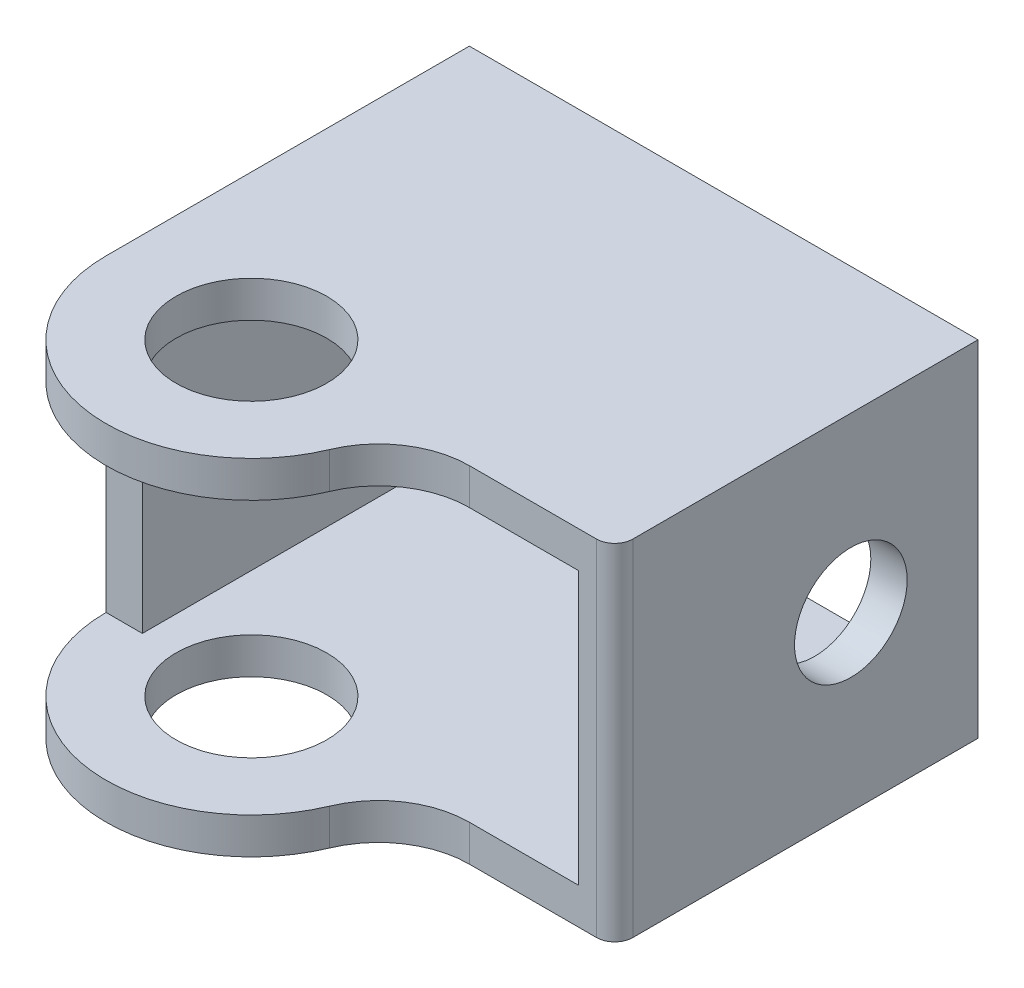
ISO-10303-21;
HEADER;
FILE_DESCRIPTION(('STEP AP214'),'2;1');
FILE_NAME('part.step','',(''),(''),'','','');
FILE_SCHEMA(('AUTOMOTIVE_DESIGN { 1 0 10303 214 1 1 1 1 }'));
ENDSEC;
DATA;
#1=APPLICATION_CONTEXT('core data for automotive mechanical design processes');
#2=APPLICATION_PROTOCOL_DEFINITION('international standard','automotive_design',2000,#1);
#3=PRODUCT_CONTEXT('',#1,'mechanical');
#4=PRODUCT('Part','Part','',(#3));
#5=PRODUCT_RELATED_PRODUCT_CATEGORY('part','',(#4));
#6=PRODUCT_DEFINITION_FORMATION('','',#4);
#7=PRODUCT_DEFINITION_CONTEXT('part definition',#1,'design');
#8=PRODUCT_DEFINITION('design','',#6,#7);
#9=PRODUCT_DEFINITION_SHAPE('','',#8);
#10=(LENGTH_UNIT() NAMED_UNIT(*) SI_UNIT(.MILLI.,.METRE.));
#11=(NAMED_UNIT(*) PLANE_ANGLE_UNIT() SI_UNIT($,.RADIAN.));
#12=(NAMED_UNIT(*) SI_UNIT($,.STERADIAN.) SOLID_ANGLE_UNIT());
#13=UNCERTAINTY_MEASURE_WITH_UNIT(LENGTH_MEASURE(1.E-05),#10,'distance_accuracy_value','');
#14=(GEOMETRIC_REPRESENTATION_CONTEXT(3) GLOBAL_UNCERTAINTY_ASSIGNED_CONTEXT((#13)) GLOBAL_UNIT_ASSIGNED_CONTEXT((#10,
#11,#12)) REPRESENTATION_CONTEXT('',''));
#15=CARTESIAN_POINT('',(0.,0.,0.));
#16=DIRECTION('',(0.,0.,1.));
#17=DIRECTION('',(1.,0.,0.));
#18=AXIS2_PLACEMENT_3D('',#15,#16,#17);
#19=CARTESIAN_POINT('',(-3.61630695443645,19.,11.3717026378897));
#20=DIRECTION('',(0.,-1.,0.));
#21=DIRECTION('',(0.,0.,-1.));
#22=AXIS2_PLACEMENT_3D('',#19,#20,#21);
#23=CYLINDRICAL_SURFACE('',#22,8.);
#24=CARTESIAN_POINT('',(-3.61630695443645,2.,11.3717026378897));
#25=DIRECTION('',(0.,-1.,0.));
#26=DIRECTION('',(0.,0.,-1.));
#27=AXIS2_PLACEMENT_3D('',#24,#25,#26);
#28=CIRCLE('',#27,8.);
#29=CARTESIAN_POINT('',(3.76830843017894,2.,14.4486257148128));
#30=VERTEX_POINT('',#29);
#31=CARTESIAN_POINT('',(-11.6163069544364,2.,11.3717026378897));
#32=VERTEX_POINT('',#31);
#33=EDGE_CURVE('E183',#30,#32,#28,.T.);
#34=ORIENTED_EDGE('',*,*,#33,.T.);
#35=DIRECTION('',(0.,-1.,0.));
#36=VECTOR('',#35,1.);
#37=CARTESIAN_POINT('',(-11.6163069544364,19.,11.3717026378897));
#38=LINE('',#37,#36);
#39=CARTESIAN_POINT('',(-11.6163069544364,0.,11.3717026378897));
#40=VERTEX_POINT('',#39);
#41=EDGE_CURVE('E161',#32,#40,#38,.T.);
#42=ORIENTED_EDGE('',*,*,#41,.T.);
#43=CARTESIAN_POINT('',(-3.61630695443645,0.,11.3717026378897));
#44=DIRECTION('',(0.,1.,0.));
#45=DIRECTION('',(0.,0.,1.));
#46=AXIS2_PLACEMENT_3D('',#43,#44,#45);
#47=CIRCLE('',#46,8.);
#48=CARTESIAN_POINT('',(3.76830843017894,0.,14.4486257148128));
#49=VERTEX_POINT('',#48);
#50=EDGE_CURVE('E226',#40,#49,#47,.T.);
#51=ORIENTED_EDGE('',*,*,#50,.T.);
#52=DIRECTION('',(0.,-1.,0.));
#53=VECTOR('',#52,1.);
#54=CARTESIAN_POINT('',(3.76830843017894,19.,14.4486257148128));
#55=LINE('',#54,#53);
#56=EDGE_CURVE('E242',#30,#49,#55,.T.);
#57=ORIENTED_EDGE('',*,*,#56,.F.);
#58=EDGE_LOOP('',(#34,#42,#51,#57));
#59=FACE_BOUND('',#58,.T.);
#60=ADVANCED_FACE('F32',(#59),#23,.T.);
#61=CARTESIAN_POINT('',(8.38369304556355,19.,16.3717026378897));
#62=DIRECTION('',(0.,-1.,0.));
#63=DIRECTION('',(0.,0.,-1.));
#64=AXIS2_PLACEMENT_3D('',#61,#62,#63);
#65=CYLINDRICAL_SURFACE('',#64,5.);
#66=CARTESIAN_POINT('',(3.76830843017894,19.,14.4486257148128));
#67=VERTEX_POINT('',#66);
#68=CARTESIAN_POINT('',(3.76830843017894,17.,14.4486257148128));
#69=VERTEX_POINT('',#68);
#70=EDGE_CURVE('E169',#67,#69,#55,.T.);
#71=ORIENTED_EDGE('',*,*,#70,.T.);
#72=CARTESIAN_POINT('',(8.38369304556355,17.,16.3717026378897));
#73=DIRECTION('',(0.,1.,0.));
#74=DIRECTION('',(0.,0.,1.));
#75=AXIS2_PLACEMENT_3D('',#72,#73,#74);
#76=CIRCLE('',#75,5.);
#77=CARTESIAN_POINT('',(8.38369304556355,17.,11.3717026378897));
#78=VERTEX_POINT('',#77);
#79=EDGE_CURVE('E136',#69,#78,#76,.F.);
#80=ORIENTED_EDGE('',*,*,#79,.T.);
#81=DIRECTION('',(0.,-1.,0.));
#82=VECTOR('',#81,1.);
#83=CARTESIAN_POINT('',(8.38369304556355,19.,11.3717026378897));
#84=LINE('',#83,#82);
#85=CARTESIAN_POINT('',(8.38369304556355,19.,11.3717026378897));
#86=VERTEX_POINT('',#85);
#87=EDGE_CURVE('E240',#86,#78,#84,.T.);
#88=ORIENTED_EDGE('',*,*,#87,.F.);
#89=CARTESIAN_POINT('',(8.38369304556355,19.,16.3717026378897));
#90=DIRECTION('',(0.,-1.,0.));
#91=DIRECTION('',(0.,0.,-1.));
#92=AXIS2_PLACEMENT_3D('',#89,#90,#91);
#93=CIRCLE('',#92,5.);
#94=EDGE_CURVE('E213',#67,#86,#93,.T.);
#95=ORIENTED_EDGE('',*,*,#94,.F.);
#96=EDGE_LOOP('',(#71,#80,#88,#95));
#97=FACE_BOUND('',#96,.T.);
#98=ADVANCED_FACE('F273',(#97),#65,.F.);
#99=CARTESIAN_POINT('',(-3.61630695443645,19.,11.3717026378897));
#100=DIRECTION('',(0.,-1.,0.));
#101=DIRECTION('',(0.,0.,-1.));
#102=AXIS2_PLACEMENT_3D('',#99,#100,#101);
#103=CYLINDRICAL_SURFACE('',#102,4.15);
#104=CARTESIAN_POINT('',(-3.61630695443645,17.,11.3717026378897));
#105=DIRECTION('',(0.,1.,0.));
#106=DIRECTION('',(0.,0.,1.));
#107=AXIS2_PLACEMENT_3D('',#104,#105,#106);
#108=CIRCLE('',#107,4.15);
#109=CARTESIAN_POINT('',(-3.61630695443645,17.,15.5217026378897));
#110=VERTEX_POINT('',#109);
#111=EDGE_CURVE('E180',#110,#110,#108,.T.);
#112=ORIENTED_EDGE('',*,*,#111,.F.);
#113=EDGE_LOOP('',(#112));
#114=FACE_BOUND('',#113,.T.);
#115=CARTESIAN_POINT('',(-3.61630695443645,19.,11.3717026378897));
#116=DIRECTION('',(0.,1.,0.));
#117=DIRECTION('',(0.,0.,-1.));
#118=AXIS2_PLACEMENT_3D('',#115,#116,#117);
#119=CIRCLE('',#118,4.15);
#120=CARTESIAN_POINT('',(-3.61630695443645,19.,7.22170263788969));
#121=VERTEX_POINT('',#120);
#122=EDGE_CURVE('E198',#121,#121,#119,.T.);
#123=ORIENTED_EDGE('',*,*,#122,.T.);
#124=EDGE_LOOP('',(#123));
#125=FACE_BOUND('',#124,.T.);
#126=ADVANCED_FACE('F275',(#114,#125),#103,.F.);
#127=CARTESIAN_POINT('',(15.3836930455636,19.,10.3717026378897));
#128=DIRECTION('',(0.,-1.,0.));
#129=DIRECTION('',(0.,0.,-1.));
#130=AXIS2_PLACEMENT_3D('',#127,#128,#129);
#131=PLANE('',#130);
#132=DIRECTION('',(0.,0.,-1.));
#133=VECTOR('',#132,1.);
#134=CARTESIAN_POINT('',(16.3836930455636,19.,-8.62829736211031));
#135=LINE('',#134,#133);
#136=CARTESIAN_POINT('',(16.3836930455636,19.,10.3717026378897));
#137=VERTEX_POINT('',#136);
#138=CARTESIAN_POINT('',(16.3836930455636,19.,-8.62829736211031));
#139=VERTEX_POINT('',#138);
#140=EDGE_CURVE('E204',#137,#139,#135,.T.);
#141=ORIENTED_EDGE('',*,*,#140,.T.);
#142=DIRECTION('',(-1.,0.,0.));
#143=VECTOR('',#142,1.);
#144=CARTESIAN_POINT('',(16.3836930455636,19.,-8.62829736211031));
#145=LINE('',#144,#143);
#146=CARTESIAN_POINT('',(-11.6163069544365,19.,-8.62829736211031));
#147=VERTEX_POINT('',#146);
#148=EDGE_CURVE('E207',#139,#147,#145,.T.);
#149=ORIENTED_EDGE('',*,*,#148,.T.);
#150=DIRECTION('',(0.,0.,1.));
#151=VECTOR('',#150,1.);
#152=CARTESIAN_POINT('',(-11.6163069544365,19.,-8.62829736211031));
#153=LINE('',#152,#151);
#154=CARTESIAN_POINT('',(-11.6163069544364,19.,11.3717026378897));
#155=VERTEX_POINT('',#154);
#156=EDGE_CURVE('E210',#147,#155,#153,.T.);
#157=ORIENTED_EDGE('',*,*,#156,.T.);
#158=CARTESIAN_POINT('',(-3.61630695443645,19.,11.3717026378897));
#159=DIRECTION('',(0.,1.,0.));
#160=DIRECTION('',(0.,0.,1.));
#161=AXIS2_PLACEMENT_3D('',#158,#159,#160);
#162=CIRCLE('',#161,8.);
#163=EDGE_CURVE('E164',#155,#67,#162,.T.);
#164=ORIENTED_EDGE('',*,*,#163,.T.);
#165=ORIENTED_EDGE('',*,*,#94,.T.);
#166=DIRECTION('',(1.,0.,0.));
#167=VECTOR('',#166,1.);
#168=CARTESIAN_POINT('',(15.3836930455636,19.,11.3717026378897));
#169=LINE('',#168,#167);
#170=CARTESIAN_POINT('',(15.3836930455636,19.,11.3717026378897));
#171=VERTEX_POINT('',#170);
#172=EDGE_CURVE('E215',#86,#171,#169,.T.);
#173=ORIENTED_EDGE('',*,*,#172,.T.);
#174=CARTESIAN_POINT('',(15.3836930455636,19.,10.3717026378897));
#175=DIRECTION('',(0.,1.,0.));
#176=DIRECTION('',(0.,0.,-1.));
#177=AXIS2_PLACEMENT_3D('',#174,#175,#176);
#178=CIRCLE('',#177,1.);
#179=EDGE_CURVE('E217',#171,#137,#178,.T.);
#180=ORIENTED_EDGE('',*,*,#179,.T.);
#181=EDGE_LOOP('',(#141,#149,#157,#164,#165,#173,#180));
#182=FACE_BOUND('',#181,.T.);
#183=ORIENTED_EDGE('',*,*,#122,.F.);
#184=EDGE_LOOP('',(#183));
#185=FACE_BOUND('',#184,.T.);
#186=ADVANCED_FACE('F268',(#182,#185),#131,.F.);
#187=CARTESIAN_POINT('',(15.3836930455636,0.,10.3717026378897));
#188=DIRECTION('',(0.,-1.,0.));
#189=DIRECTION('',(0.,0.,-1.));
#190=AXIS2_PLACEMENT_3D('',#187,#188,#189);
#191=PLANE('',#190);
#192=DIRECTION('',(0.,0.,-1.));
#193=VECTOR('',#192,1.);
#194=CARTESIAN_POINT('',(16.3836930455636,0.,-8.62829736211031));
#195=LINE('',#194,#193);
#196=CARTESIAN_POINT('',(16.3836930455636,0.,10.3717026378897));
#197=VERTEX_POINT('',#196);
#198=CARTESIAN_POINT('',(16.3836930455636,0.,-8.62829736211031));
#199=VERTEX_POINT('',#198);
#200=EDGE_CURVE('E201',#197,#199,#195,.T.);
#201=ORIENTED_EDGE('',*,*,#200,.F.);
#202=CARTESIAN_POINT('',(15.3836930455636,0.,10.3717026378897));
#203=DIRECTION('',(0.,1.,0.));
#204=DIRECTION('',(0.,0.,-1.));
#205=AXIS2_PLACEMENT_3D('',#202,#203,#204);
#206=CIRCLE('',#205,1.);
#207=CARTESIAN_POINT('',(15.3836930455636,0.,11.3717026378897));
#208=VERTEX_POINT('',#207);
#209=EDGE_CURVE('E208',#208,#197,#206,.T.);
#210=ORIENTED_EDGE('',*,*,#209,.F.);
#211=DIRECTION('',(1.,0.,0.));
#212=VECTOR('',#211,1.);
#213=CARTESIAN_POINT('',(15.3836930455636,0.,11.3717026378897));
#214=LINE('',#213,#212);
#215=CARTESIAN_POINT('',(8.38369304556355,0.,11.3717026378897));
#216=VERTEX_POINT('',#215);
#217=EDGE_CURVE('E232',#216,#208,#214,.T.);
#218=ORIENTED_EDGE('',*,*,#217,.F.);
#219=CARTESIAN_POINT('',(8.38369304556355,0.,16.3717026378897));
#220=DIRECTION('',(0.,-1.,0.));
#221=DIRECTION('',(0.,0.,-1.));
#222=AXIS2_PLACEMENT_3D('',#219,#220,#221);
#223=CIRCLE('',#222,5.);
#224=EDGE_CURVE('E229',#49,#216,#223,.T.);
#225=ORIENTED_EDGE('',*,*,#224,.F.);
#226=ORIENTED_EDGE('',*,*,#50,.F.);
#227=DIRECTION('',(0.,0.,1.));
#228=VECTOR('',#227,1.);
#229=CARTESIAN_POINT('',(-11.6163069544365,0.,-8.62829736211031));
#230=LINE('',#229,#228);
#231=CARTESIAN_POINT('',(-11.6163069544365,0.,-8.62829736211031));
#232=VERTEX_POINT('',#231);
#233=EDGE_CURVE('E224',#232,#40,#230,.T.);
#234=ORIENTED_EDGE('',*,*,#233,.F.);
#235=DIRECTION('',(-1.,0.,0.));
#236=VECTOR('',#235,1.);
#237=CARTESIAN_POINT('',(16.3836930455636,0.,-8.62829736211031));
#238=LINE('',#237,#236);
#239=EDGE_CURVE('E222',#199,#232,#238,.T.);
#240=ORIENTED_EDGE('',*,*,#239,.F.);
#241=EDGE_LOOP('',(#201,#210,#218,#225,#226,#234,#240));
#242=FACE_BOUND('',#241,.T.);
#243=CARTESIAN_POINT('',(-3.61630695443645,0.,11.3717026378897));
#244=DIRECTION('',(0.,1.,0.));
#245=DIRECTION('',(0.,0.,1.));
#246=AXIS2_PLACEMENT_3D('',#243,#244,#245);
#247=CIRCLE('',#246,4.15);
#248=CARTESIAN_POINT('',(-3.61630695443645,0.,15.5217026378897));
#249=VERTEX_POINT('',#248);
#250=EDGE_CURVE('E141',#249,#249,#247,.T.);
#251=ORIENTED_EDGE('',*,*,#250,.T.);
#252=EDGE_LOOP('',(#251));
#253=FACE_BOUND('',#252,.T.);
#254=ADVANCED_FACE('F258',(#242,#253),#191,.T.);
#255=CARTESIAN_POINT('',(16.3836930455636,19.,-8.62829736211031));
#256=DIRECTION('',(-1.,0.,0.));
#257=DIRECTION('',(0.,0.,1.));
#258=AXIS2_PLACEMENT_3D('',#255,#256,#257);
#259=PLANE('',#258);
#260=CARTESIAN_POINT('',(16.3836930455636,9.5,-1.62829736211031));
#261=DIRECTION('',(1.,0.,0.));
#262=DIRECTION('',(0.,0.,-1.));
#263=AXIS2_PLACEMENT_3D('',#260,#261,#262);
#264=CIRCLE('',#263,3.1);
#265=CARTESIAN_POINT('',(16.3836930455636,9.5,-4.72829736211031));
#266=VERTEX_POINT('',#265);
#267=EDGE_CURVE('E334',#266,#266,#264,.T.);
#268=ORIENTED_EDGE('',*,*,#267,.F.);
#269=EDGE_LOOP('',(#268));
#270=FACE_BOUND('',#269,.T.);
#271=ORIENTED_EDGE('',*,*,#200,.T.);
#272=DIRECTION('',(0.,-1.,0.));
#273=VECTOR('',#272,1.);
#274=CARTESIAN_POINT('',(16.3836930455636,19.,-8.62829736211031));
#275=LINE('',#274,#273);
#276=EDGE_CURVE('E41',#139,#199,#275,.T.);
#277=ORIENTED_EDGE('',*,*,#276,.F.);
#278=ORIENTED_EDGE('',*,*,#140,.F.);
#279=DIRECTION('',(0.,-1.,0.));
#280=VECTOR('',#279,1.);
#281=CARTESIAN_POINT('',(16.3836930455636,19.,10.3717026378897));
#282=LINE('',#281,#280);
#283=EDGE_CURVE('E219',#137,#197,#282,.T.);
#284=ORIENTED_EDGE('',*,*,#283,.T.);
#285=EDGE_LOOP('',(#271,#277,#278,#284));
#286=FACE_BOUND('',#285,.T.);
#287=ADVANCED_FACE('F34',(#270,#286),#259,.F.);
#288=CARTESIAN_POINT('',(16.3836930455636,19.,-8.62829736211031));
#289=DIRECTION('',(0.,0.,1.));
#290=DIRECTION('',(1.,0.,0.));
#291=AXIS2_PLACEMENT_3D('',#288,#289,#290);
#292=PLANE('',#291);
#293=DIRECTION('',(-1.,0.,0.));
#294=VECTOR('',#293,1.);
#295=CARTESIAN_POINT('',(14.3836930455636,2.,-8.62829736211031));
#296=LINE('',#295,#294);
#297=CARTESIAN_POINT('',(14.3836930455636,2.,-8.62829736211031));
#298=VERTEX_POINT('',#297);
#299=CARTESIAN_POINT('',(-9.61630695443645,2.,-8.62829736211031));
#300=VERTEX_POINT('',#299);
#301=EDGE_CURVE('E306',#298,#300,#296,.T.);
#302=ORIENTED_EDGE('',*,*,#301,.F.);
#303=DIRECTION('',(0.,-1.,0.));
#304=VECTOR('',#303,1.);
#305=CARTESIAN_POINT('',(14.3836930455636,17.,-8.62829736211031));
#306=LINE('',#305,#304);
#307=CARTESIAN_POINT('',(14.3836930455636,17.,-8.62829736211031));
#308=VERTEX_POINT('',#307);
#309=EDGE_CURVE('E56',#308,#298,#306,.T.);
#310=ORIENTED_EDGE('',*,*,#309,.F.);
#311=DIRECTION('',(1.,0.,0.));
#312=VECTOR('',#311,1.);
#313=CARTESIAN_POINT('',(-9.61630695443645,17.,-8.62829736211031));
#314=LINE('',#313,#312);
#315=CARTESIAN_POINT('',(-9.61630695443645,17.,-8.62829736211031));
#316=VERTEX_POINT('',#315);
#317=EDGE_CURVE('E314',#316,#308,#314,.T.);
#318=ORIENTED_EDGE('',*,*,#317,.F.);
#319=DIRECTION('',(0.,1.,0.));
#320=VECTOR('',#319,1.);
#321=CARTESIAN_POINT('',(-9.61630695443645,2.,-8.62829736211031));
#322=LINE('',#321,#320);
#323=EDGE_CURVE('E310',#300,#316,#322,.T.);
#324=ORIENTED_EDGE('',*,*,#323,.F.);
#325=EDGE_LOOP('',(#302,#310,#318,#324));
#326=FACE_BOUND('',#325,.T.);
#327=ORIENTED_EDGE('',*,*,#239,.T.);
#328=DIRECTION('',(0.,-1.,0.));
#329=VECTOR('',#328,1.);
#330=CARTESIAN_POINT('',(-11.6163069544365,19.,-8.62829736211031));
#331=LINE('',#330,#329);
#332=EDGE_CURVE('E165',#147,#232,#331,.T.);
#333=ORIENTED_EDGE('',*,*,#332,.F.);
#334=ORIENTED_EDGE('',*,*,#148,.F.);
#335=ORIENTED_EDGE('',*,*,#276,.T.);
#336=EDGE_LOOP('',(#327,#333,#334,#335));
#337=FACE_BOUND('',#336,.T.);
#338=ADVANCED_FACE('F294',(#326,#337),#292,.F.);
#339=CARTESIAN_POINT('',(-11.6163069544365,19.,-8.62829736211031));
#340=DIRECTION('',(1.,0.,0.));
#341=DIRECTION('',(0.,0.,-1.));
#342=AXIS2_PLACEMENT_3D('',#339,#340,#341);
#343=PLANE('',#342);
#344=ORIENTED_EDGE('',*,*,#233,.T.);
#345=ORIENTED_EDGE('',*,*,#41,.F.);
#346=DIRECTION('',(0.,-1.,0.));
#347=VECTOR('',#346,1.);
#348=CARTESIAN_POINT('',(-11.6163069544364,17.,11.3717026378897));
#349=LINE('',#348,#347);
#350=CARTESIAN_POINT('',(-11.6163069544364,17.,11.3717026378897));
#351=VERTEX_POINT('',#350);
#352=EDGE_CURVE('E147',#351,#32,#349,.T.);
#353=ORIENTED_EDGE('',*,*,#352,.F.);
#354=EDGE_CURVE('E159',#155,#351,#38,.T.);
#355=ORIENTED_EDGE('',*,*,#354,.F.);
#356=ORIENTED_EDGE('',*,*,#156,.F.);
#357=ORIENTED_EDGE('',*,*,#332,.T.);
#358=EDGE_LOOP('',(#344,#345,#353,#355,#356,#357));
#359=FACE_BOUND('',#358,.T.);
#360=ADVANCED_FACE('F157',(#359),#343,.F.);
#361=ORIENTED_EDGE('',*,*,#354,.T.);
#362=CARTESIAN_POINT('',(-3.61630695443645,17.,11.3717026378897));
#363=DIRECTION('',(0.,1.,0.));
#364=DIRECTION('',(0.,0.,1.));
#365=AXIS2_PLACEMENT_3D('',#362,#363,#364);
#366=CIRCLE('',#365,8.);
#367=EDGE_CURVE('E133',#351,#69,#366,.T.);
#368=ORIENTED_EDGE('',*,*,#367,.T.);
#369=ORIENTED_EDGE('',*,*,#70,.F.);
#370=ORIENTED_EDGE('',*,*,#163,.F.);
#371=EDGE_LOOP('',(#361,#368,#369,#370));
#372=FACE_BOUND('',#371,.T.);
#373=ADVANCED_FACE('F163',(#372),#23,.T.);
#374=CARTESIAN_POINT('',(8.38369304556355,2.,11.3717026378897));
#375=VERTEX_POINT('',#374);
#376=EDGE_CURVE('E239',#375,#216,#84,.T.);
#377=ORIENTED_EDGE('',*,*,#376,.F.);
#378=CARTESIAN_POINT('',(8.38369304556355,2.,16.3717026378897));
#379=DIRECTION('',(0.,-1.,0.));
#380=DIRECTION('',(0.,0.,-1.));
#381=AXIS2_PLACEMENT_3D('',#378,#379,#380);
#382=CIRCLE('',#381,5.);
#383=EDGE_CURVE('E188',#375,#30,#382,.F.);
#384=ORIENTED_EDGE('',*,*,#383,.T.);
#385=ORIENTED_EDGE('',*,*,#56,.T.);
#386=ORIENTED_EDGE('',*,*,#224,.T.);
#387=EDGE_LOOP('',(#377,#384,#385,#386));
#388=FACE_BOUND('',#387,.T.);
#389=ADVANCED_FACE('F254',(#388),#65,.F.);
#390=CARTESIAN_POINT('',(15.3836930455636,19.,11.3717026378897));
#391=DIRECTION('',(0.,0.,-1.));
#392=DIRECTION('',(-1.,0.,0.));
#393=AXIS2_PLACEMENT_3D('',#390,#391,#392);
#394=PLANE('',#393);
#395=DIRECTION('',(1.,0.,0.));
#396=VECTOR('',#395,1.);
#397=CARTESIAN_POINT('',(15.3836930455636,17.,11.3717026378897));
#398=LINE('',#397,#396);
#399=CARTESIAN_POINT('',(14.3836930455636,17.,11.3717026378897));
#400=VERTEX_POINT('',#399);
#401=EDGE_CURVE('E182',#78,#400,#398,.T.);
#402=ORIENTED_EDGE('',*,*,#401,.T.);
#403=DIRECTION('',(0.,-1.,0.));
#404=VECTOR('',#403,1.);
#405=CARTESIAN_POINT('',(14.3836930455636,19.,11.3717026378897));
#406=LINE('',#405,#404);
#407=CARTESIAN_POINT('',(14.3836930455636,2.,11.3717026378897));
#408=VERTEX_POINT('',#407);
#409=EDGE_CURVE('E11',#400,#408,#406,.T.);
#410=ORIENTED_EDGE('',*,*,#409,.T.);
#411=DIRECTION('',(-1.,0.,0.));
#412=VECTOR('',#411,1.);
#413=CARTESIAN_POINT('',(15.3836930455636,2.,11.3717026378897));
#414=LINE('',#413,#412);
#415=EDGE_CURVE('E178',#408,#375,#414,.T.);
#416=ORIENTED_EDGE('',*,*,#415,.T.);
#417=ORIENTED_EDGE('',*,*,#376,.T.);
#418=ORIENTED_EDGE('',*,*,#217,.T.);
#419=DIRECTION('',(0.,-1.,0.));
#420=VECTOR('',#419,1.);
#421=CARTESIAN_POINT('',(15.3836930455636,19.,11.3717026378897));
#422=LINE('',#421,#420);
#423=EDGE_CURVE('E238',#171,#208,#422,.T.);
#424=ORIENTED_EDGE('',*,*,#423,.F.);
#425=ORIENTED_EDGE('',*,*,#172,.F.);
#426=ORIENTED_EDGE('',*,*,#87,.T.);
#427=EDGE_LOOP('',(#402,#410,#416,#417,#418,#424,#425,#426));
#428=FACE_BOUND('',#427,.T.);
#429=ADVANCED_FACE('F248',(#428),#394,.F.);
#430=CARTESIAN_POINT('',(15.3836930455636,19.,10.3717026378897));
#431=DIRECTION('',(0.,-1.,0.));
#432=DIRECTION('',(0.,0.,-1.));
#433=AXIS2_PLACEMENT_3D('',#430,#431,#432);
#434=CYLINDRICAL_SURFACE('',#433,1.);
#435=ORIENTED_EDGE('',*,*,#209,.T.);
#436=ORIENTED_EDGE('',*,*,#283,.F.);
#437=ORIENTED_EDGE('',*,*,#179,.F.);
#438=ORIENTED_EDGE('',*,*,#423,.T.);
#439=EDGE_LOOP('',(#435,#436,#437,#438));
#440=FACE_BOUND('',#439,.T.);
#441=ADVANCED_FACE('F262',(#440),#434,.T.);
#442=CARTESIAN_POINT('',(-3.61630695443645,2.,11.3717026378897));
#443=DIRECTION('',(0.,-1.,0.));
#444=DIRECTION('',(0.,0.,-1.));
#445=AXIS2_PLACEMENT_3D('',#442,#443,#444);
#446=CIRCLE('',#445,4.15);
#447=CARTESIAN_POINT('',(-3.61630695443645,2.,7.22170263788969));
#448=VERTEX_POINT('',#447);
#449=EDGE_CURVE('E175',#448,#448,#446,.T.);
#450=ORIENTED_EDGE('',*,*,#449,.F.);
#451=EDGE_LOOP('',(#450));
#452=FACE_BOUND('',#451,.T.);
#453=ORIENTED_EDGE('',*,*,#250,.F.);
#454=EDGE_LOOP('',(#453));
#455=FACE_BOUND('',#454,.T.);
#456=ADVANCED_FACE('F283',(#452,#455),#103,.F.);
#457=CARTESIAN_POINT('',(-9.61630695443645,2.,19.3717026378897));
#458=DIRECTION('',(-1.,0.,0.));
#459=DIRECTION('',(0.,0.,1.));
#460=AXIS2_PLACEMENT_3D('',#457,#458,#459);
#461=PLANE('',#460);
#462=DIRECTION('',(0.,0.,-1.));
#463=VECTOR('',#462,1.);
#464=CARTESIAN_POINT('',(-9.61630695443645,17.,19.3717026378897));
#465=LINE('',#464,#463);
#466=CARTESIAN_POINT('',(-9.61630695443645,17.,11.3717026378897));
#467=VERTEX_POINT('',#466);
#468=EDGE_CURVE('E323',#467,#316,#465,.T.);
#469=ORIENTED_EDGE('',*,*,#468,.F.);
#470=DIRECTION('',(0.,-1.,0.));
#471=VECTOR('',#470,1.);
#472=CARTESIAN_POINT('',(-9.61630695443645,2.,11.3717026378897));
#473=LINE('',#472,#471);
#474=CARTESIAN_POINT('',(-9.61630695443645,2.,11.3717026378897));
#475=VERTEX_POINT('',#474);
#476=EDGE_CURVE('E150',#467,#475,#473,.T.);
#477=ORIENTED_EDGE('',*,*,#476,.T.);
#478=DIRECTION('',(0.,0.,-1.));
#479=VECTOR('',#478,1.);
#480=CARTESIAN_POINT('',(-9.61630695443645,2.,19.3717026378897));
#481=LINE('',#480,#479);
#482=EDGE_CURVE('E325',#475,#300,#481,.T.);
#483=ORIENTED_EDGE('',*,*,#482,.T.);
#484=ORIENTED_EDGE('',*,*,#323,.T.);
#485=EDGE_LOOP('',(#469,#477,#483,#484));
#486=FACE_BOUND('',#485,.T.);
#487=ADVANCED_FACE('F331',(#486),#461,.F.);
#488=CARTESIAN_POINT('',(14.3836930455636,17.,19.3717026378897));
#489=DIRECTION('',(1.,0.,0.));
#490=DIRECTION('',(0.,0.,-1.));
#491=AXIS2_PLACEMENT_3D('',#488,#489,#490);
#492=PLANE('',#491);
#493=CARTESIAN_POINT('',(14.3836930455636,9.5,-1.62829736211031));
#494=DIRECTION('',(1.,0.,0.));
#495=DIRECTION('',(0.,0.,-1.));
#496=AXIS2_PLACEMENT_3D('',#493,#494,#495);
#497=CIRCLE('',#496,3.1);
#498=CARTESIAN_POINT('',(14.3836930455636,9.5,-4.72829736211031));
#499=VERTEX_POINT('',#498);
#500=EDGE_CURVE('E36',#499,#499,#497,.T.);
#501=ORIENTED_EDGE('',*,*,#500,.T.);
#502=EDGE_LOOP('',(#501));
#503=FACE_BOUND('',#502,.T.);
#504=DIRECTION('',(0.,0.,-1.));
#505=VECTOR('',#504,1.);
#506=CARTESIAN_POINT('',(14.3836930455636,17.,19.3717026378897));
#507=LINE('',#506,#505);
#508=EDGE_CURVE('E179',#400,#308,#507,.T.);
#509=ORIENTED_EDGE('',*,*,#508,.T.);
#510=ORIENTED_EDGE('',*,*,#309,.T.);
#511=DIRECTION('',(0.,0.,-1.));
#512=VECTOR('',#511,1.);
#513=CARTESIAN_POINT('',(14.3836930455636,2.,19.3717026378897));
#514=LINE('',#513,#512);
#515=EDGE_CURVE('E321',#408,#298,#514,.T.);
#516=ORIENTED_EDGE('',*,*,#515,.F.);
#517=ORIENTED_EDGE('',*,*,#409,.F.);
#518=EDGE_LOOP('',(#509,#510,#516,#517));
#519=FACE_BOUND('',#518,.T.);
#520=ADVANCED_FACE('F328',(#503,#519),#492,.F.);
#521=CARTESIAN_POINT('',(-9.61630695443645,17.,19.3717026378897));
#522=DIRECTION('',(0.,1.,0.));
#523=DIRECTION('',(0.,0.,1.));
#524=AXIS2_PLACEMENT_3D('',#521,#522,#523);
#525=PLANE('',#524);
#526=ORIENTED_EDGE('',*,*,#111,.T.);
#527=EDGE_LOOP('',(#526));
#528=FACE_BOUND('',#527,.T.);
#529=ORIENTED_EDGE('',*,*,#401,.F.);
#530=ORIENTED_EDGE('',*,*,#79,.F.);
#531=ORIENTED_EDGE('',*,*,#367,.F.);
#532=DIRECTION('',(-1.,0.,0.));
#533=VECTOR('',#532,1.);
#534=CARTESIAN_POINT('',(16.3836930455636,17.,11.3717026378897));
#535=LINE('',#534,#533);
#536=EDGE_CURVE('E48',#467,#351,#535,.T.);
#537=ORIENTED_EDGE('',*,*,#536,.F.);
#538=ORIENTED_EDGE('',*,*,#468,.T.);
#539=ORIENTED_EDGE('',*,*,#317,.T.);
#540=ORIENTED_EDGE('',*,*,#508,.F.);
#541=EDGE_LOOP('',(#529,#530,#531,#537,#538,#539,#540));
#542=FACE_BOUND('',#541,.T.);
#543=ADVANCED_FACE('F134',(#528,#542),#525,.F.);
#544=CARTESIAN_POINT('',(14.3836930455636,2.,19.3717026378897));
#545=DIRECTION('',(0.,-1.,0.));
#546=DIRECTION('',(0.,0.,-1.));
#547=AXIS2_PLACEMENT_3D('',#544,#545,#546);
#548=PLANE('',#547);
#549=ORIENTED_EDGE('',*,*,#449,.T.);
#550=EDGE_LOOP('',(#549));
#551=FACE_BOUND('',#550,.T.);
#552=ORIENTED_EDGE('',*,*,#482,.F.);
#553=DIRECTION('',(-1.,0.,0.));
#554=VECTOR('',#553,1.);
#555=CARTESIAN_POINT('',(16.3836930455636,2.,11.3717026378897));
#556=LINE('',#555,#554);
#557=EDGE_CURVE('E152',#475,#32,#556,.T.);
#558=ORIENTED_EDGE('',*,*,#557,.T.);
#559=ORIENTED_EDGE('',*,*,#33,.F.);
#560=ORIENTED_EDGE('',*,*,#383,.F.);
#561=ORIENTED_EDGE('',*,*,#415,.F.);
#562=ORIENTED_EDGE('',*,*,#515,.T.);
#563=ORIENTED_EDGE('',*,*,#301,.T.);
#564=EDGE_LOOP('',(#552,#558,#559,#560,#561,#562,#563));
#565=FACE_BOUND('',#564,.T.);
#566=ADVANCED_FACE('F327',(#551,#565),#548,.F.);
#567=CARTESIAN_POINT('',(16.3836930455636,17.,11.3717026378897));
#568=DIRECTION('',(0.,0.,-1.));
#569=DIRECTION('',(-1.,0.,0.));
#570=AXIS2_PLACEMENT_3D('',#567,#568,#569);
#571=PLANE('',#570);
#572=ORIENTED_EDGE('',*,*,#536,.T.);
#573=ORIENTED_EDGE('',*,*,#352,.T.);
#574=ORIENTED_EDGE('',*,*,#557,.F.);
#575=ORIENTED_EDGE('',*,*,#476,.F.);
#576=EDGE_LOOP('',(#572,#573,#574,#575));
#577=FACE_BOUND('',#576,.T.);
#578=ADVANCED_FACE('F146',(#577),#571,.F.);
#579=CARTESIAN_POINT('',(7.38369304556356,9.5,-1.62829736211031));
#580=DIRECTION('',(1.,0.,0.));
#581=DIRECTION('',(0.,0.,-1.));
#582=AXIS2_PLACEMENT_3D('',#579,#580,#581);
#583=CYLINDRICAL_SURFACE('',#582,3.1);
#584=ORIENTED_EDGE('',*,*,#267,.T.);
#585=EDGE_LOOP('',(#584));
#586=FACE_BOUND('',#585,.T.);
#587=ORIENTED_EDGE('',*,*,#500,.F.);
#588=EDGE_LOOP('',(#587));
#589=FACE_BOUND('',#588,.T.);
#590=ADVANCED_FACE('F342',(#586,#589),#583,.F.);
#591=CLOSED_SHELL('',(#60,#98,#126,#186,#254,#287,#338,#360,#373,#389,#429,#441,#456,#487,#520,
#543,#566,#578,#590));
#592=MANIFOLD_SOLID_BREP('B2',#591);
#593=ADVANCED_BREP_SHAPE_REPRESENTATION('',(#18,#592),#14);
#594=SHAPE_DEFINITION_REPRESENTATION(#9,#593);
ENDSEC;
END-ISO-10303-21;
